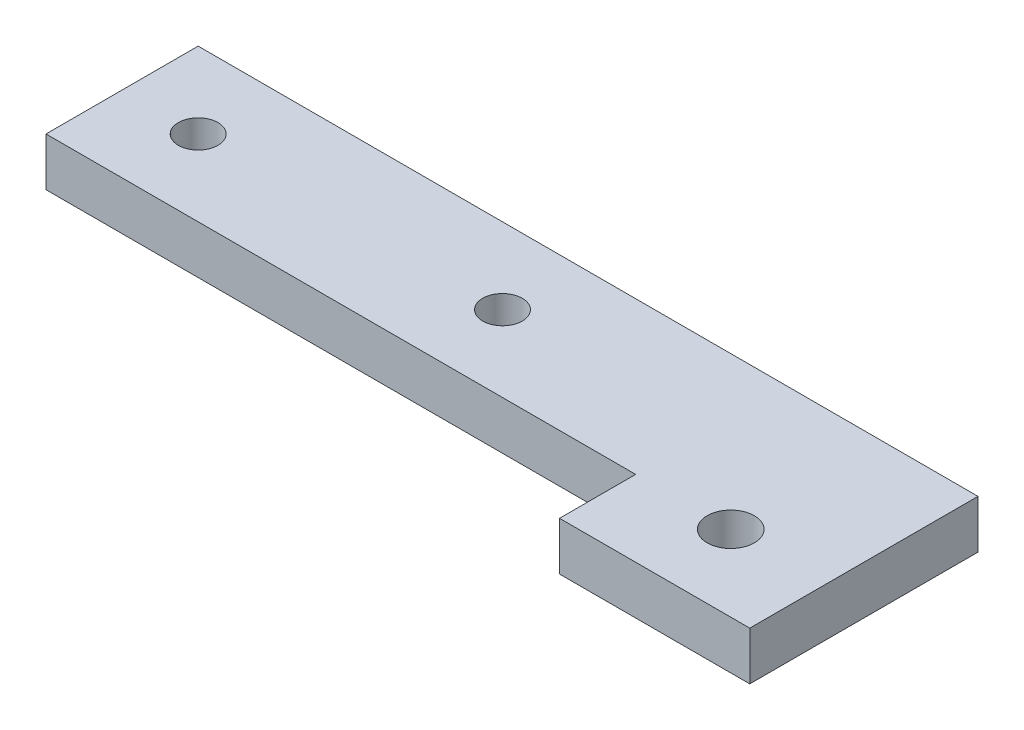
ISO-10303-21;
HEADER;
FILE_DESCRIPTION(('STEP AP214'),'2;1');
FILE_NAME('part.step','',(''),(''),'','','');
FILE_SCHEMA(('AUTOMOTIVE_DESIGN { 1 0 10303 214 1 1 1 1 }'));
ENDSEC;
DATA;
#1=APPLICATION_CONTEXT('core data for automotive mechanical design processes');
#2=APPLICATION_PROTOCOL_DEFINITION('international standard','automotive_design',2000,#1);
#3=PRODUCT_CONTEXT('',#1,'mechanical');
#4=PRODUCT('Part','Part','',(#3));
#5=PRODUCT_RELATED_PRODUCT_CATEGORY('part','',(#4));
#6=PRODUCT_DEFINITION_FORMATION('','',#4);
#7=PRODUCT_DEFINITION_CONTEXT('part definition',#1,'design');
#8=PRODUCT_DEFINITION('design','',#6,#7);
#9=PRODUCT_DEFINITION_SHAPE('','',#8);
#10=(LENGTH_UNIT() NAMED_UNIT(*) SI_UNIT(.MILLI.,.METRE.));
#11=(NAMED_UNIT(*) PLANE_ANGLE_UNIT() SI_UNIT($,.RADIAN.));
#12=(NAMED_UNIT(*) SI_UNIT($,.STERADIAN.) SOLID_ANGLE_UNIT());
#13=UNCERTAINTY_MEASURE_WITH_UNIT(LENGTH_MEASURE(1.E-05),#10,'distance_accuracy_value','');
#14=(GEOMETRIC_REPRESENTATION_CONTEXT(3) GLOBAL_UNCERTAINTY_ASSIGNED_CONTEXT((#13)) GLOBAL_UNIT_ASSIGNED_CONTEXT((#10,
#11,#12)) REPRESENTATION_CONTEXT('',''));
#15=CARTESIAN_POINT('',(0.,0.,0.));
#16=DIRECTION('',(0.,0.,1.));
#17=DIRECTION('',(1.,0.,0.));
#18=AXIS2_PLACEMENT_3D('',#15,#16,#17);
#19=CARTESIAN_POINT('',(-12.5,-3.175,10.));
#20=DIRECTION('',(0.,0.,1.));
#21=DIRECTION('',(1.,0.,0.));
#22=AXIS2_PLACEMENT_3D('',#19,#20,#21);
#23=PLANE('',#22);
#24=DIRECTION('',(0.,1.,0.));
#25=VECTOR('',#24,1.);
#26=CARTESIAN_POINT('',(12.5,-3.175,10.));
#27=LINE('',#26,#25);
#28=CARTESIAN_POINT('',(12.5,-3.175,10.));
#29=VERTEX_POINT('',#28);
#30=CARTESIAN_POINT('',(12.5,3.175,10.));
#31=VERTEX_POINT('',#30);
#32=EDGE_CURVE('E11',#29,#31,#27,.T.);
#33=ORIENTED_EDGE('',*,*,#32,.T.);
#34=DIRECTION('',(1.,0.,0.));
#35=VECTOR('',#34,1.);
#36=CARTESIAN_POINT('',(-12.5,3.175,10.));
#37=LINE('',#36,#35);
#38=CARTESIAN_POINT('',(-12.5,3.175,10.));
#39=VERTEX_POINT('',#38);
#40=EDGE_CURVE('E103',#39,#31,#37,.T.);
#41=ORIENTED_EDGE('',*,*,#40,.F.);
#42=DIRECTION('',(0.,1.,0.));
#43=VECTOR('',#42,1.);
#44=CARTESIAN_POINT('',(-12.5,-3.175,10.));
#45=LINE('',#44,#43);
#46=CARTESIAN_POINT('',(-12.5,-3.175,10.));
#47=VERTEX_POINT('',#46);
#48=EDGE_CURVE('E43',#47,#39,#45,.T.);
#49=ORIENTED_EDGE('',*,*,#48,.F.);
#50=DIRECTION('',(1.,0.,0.));
#51=VECTOR('',#50,1.);
#52=CARTESIAN_POINT('',(-12.5,-3.175,10.));
#53=LINE('',#52,#51);
#54=EDGE_CURVE('E93',#47,#29,#53,.T.);
#55=ORIENTED_EDGE('',*,*,#54,.T.);
#56=EDGE_LOOP('',(#33,#41,#49,#55));
#57=FACE_BOUND('',#56,.T.);
#58=ADVANCED_FACE('F34',(#57),#23,.T.);
#59=CARTESIAN_POINT('',(-12.5,-3.175,0.));
#60=DIRECTION('',(-1.,0.,0.));
#61=DIRECTION('',(0.,0.,1.));
#62=AXIS2_PLACEMENT_3D('',#59,#60,#61);
#63=PLANE('',#62);
#64=ORIENTED_EDGE('',*,*,#48,.T.);
#65=DIRECTION('',(0.,0.,1.));
#66=VECTOR('',#65,1.);
#67=CARTESIAN_POINT('',(-12.5,3.175,0.));
#68=LINE('',#67,#66);
#69=CARTESIAN_POINT('',(-12.5,3.175,0.));
#70=VERTEX_POINT('',#69);
#71=EDGE_CURVE('E115',#70,#39,#68,.T.);
#72=ORIENTED_EDGE('',*,*,#71,.F.);
#73=DIRECTION('',(0.,1.,0.));
#74=VECTOR('',#73,1.);
#75=CARTESIAN_POINT('',(-12.5,-3.175,0.));
#76=LINE('',#75,#74);
#77=CARTESIAN_POINT('',(-12.5,-3.175,0.));
#78=VERTEX_POINT('',#77);
#79=EDGE_CURVE('E140',#78,#70,#76,.T.);
#80=ORIENTED_EDGE('',*,*,#79,.F.);
#81=DIRECTION('',(0.,0.,1.));
#82=VECTOR('',#81,1.);
#83=CARTESIAN_POINT('',(-12.5,-3.175,0.));
#84=LINE('',#83,#82);
#85=EDGE_CURVE('E136',#78,#47,#84,.T.);
#86=ORIENTED_EDGE('',*,*,#85,.T.);
#87=EDGE_LOOP('',(#64,#72,#80,#86));
#88=FACE_BOUND('',#87,.T.);
#89=ADVANCED_FACE('F153',(#88),#63,.T.);
#90=CARTESIAN_POINT('',(-12.5,-3.175,0.));
#91=DIRECTION('',(0.,0.,1.));
#92=DIRECTION('',(1.,0.,0.));
#93=AXIS2_PLACEMENT_3D('',#90,#91,#92);
#94=PLANE('',#93);
#95=ORIENTED_EDGE('',*,*,#79,.T.);
#96=DIRECTION('',(1.,0.,0.));
#97=VECTOR('',#96,1.);
#98=CARTESIAN_POINT('',(-12.5,3.175,0.));
#99=LINE('',#98,#97);
#100=CARTESIAN_POINT('',(-90.,3.175,0.));
#101=VERTEX_POINT('',#100);
#102=EDGE_CURVE('E109',#101,#70,#99,.T.);
#103=ORIENTED_EDGE('',*,*,#102,.F.);
#104=DIRECTION('',(0.,1.,0.));
#105=VECTOR('',#104,1.);
#106=CARTESIAN_POINT('',(-90.,-3.175,0.));
#107=LINE('',#106,#105);
#108=CARTESIAN_POINT('',(-90.,-3.175,0.));
#109=VERTEX_POINT('',#108);
#110=EDGE_CURVE('E142',#109,#101,#107,.T.);
#111=ORIENTED_EDGE('',*,*,#110,.F.);
#112=DIRECTION('',(1.,0.,0.));
#113=VECTOR('',#112,1.);
#114=CARTESIAN_POINT('',(-12.5,-3.175,0.));
#115=LINE('',#114,#113);
#116=EDGE_CURVE('E133',#109,#78,#115,.T.);
#117=ORIENTED_EDGE('',*,*,#116,.T.);
#118=EDGE_LOOP('',(#95,#103,#111,#117));
#119=FACE_BOUND('',#118,.T.);
#120=ADVANCED_FACE('F150',(#119),#94,.T.);
#121=CARTESIAN_POINT('',(-90.,-3.175,-20.));
#122=DIRECTION('',(-1.,0.,0.));
#123=DIRECTION('',(0.,0.,1.));
#124=AXIS2_PLACEMENT_3D('',#121,#122,#123);
#125=PLANE('',#124);
#126=ORIENTED_EDGE('',*,*,#110,.T.);
#127=DIRECTION('',(0.,0.,1.));
#128=VECTOR('',#127,1.);
#129=CARTESIAN_POINT('',(-90.,3.175,-20.));
#130=LINE('',#129,#128);
#131=CARTESIAN_POINT('',(-90.,3.175,-20.));
#132=VERTEX_POINT('',#131);
#133=EDGE_CURVE('E107',#132,#101,#130,.T.);
#134=ORIENTED_EDGE('',*,*,#133,.F.);
#135=DIRECTION('',(0.,1.,0.));
#136=VECTOR('',#135,1.);
#137=CARTESIAN_POINT('',(-90.,-3.175,-20.));
#138=LINE('',#137,#136);
#139=CARTESIAN_POINT('',(-90.,-3.175,-20.));
#140=VERTEX_POINT('',#139);
#141=EDGE_CURVE('E92',#140,#132,#138,.T.);
#142=ORIENTED_EDGE('',*,*,#141,.F.);
#143=DIRECTION('',(0.,0.,1.));
#144=VECTOR('',#143,1.);
#145=CARTESIAN_POINT('',(-90.,-3.175,-20.));
#146=LINE('',#145,#144);
#147=EDGE_CURVE('E130',#140,#109,#146,.T.);
#148=ORIENTED_EDGE('',*,*,#147,.T.);
#149=EDGE_LOOP('',(#126,#134,#142,#148));
#150=FACE_BOUND('',#149,.T.);
#151=ADVANCED_FACE('F144',(#150),#125,.T.);
#152=CARTESIAN_POINT('',(12.5,-3.175,-20.));
#153=DIRECTION('',(0.,0.,-1.));
#154=DIRECTION('',(-1.,0.,0.));
#155=AXIS2_PLACEMENT_3D('',#152,#153,#154);
#156=PLANE('',#155);
#157=ORIENTED_EDGE('',*,*,#141,.T.);
#158=DIRECTION('',(-1.,0.,0.));
#159=VECTOR('',#158,1.);
#160=CARTESIAN_POINT('',(12.5,3.175,-20.));
#161=LINE('',#160,#159);
#162=CARTESIAN_POINT('',(12.5,3.175,-20.));
#163=VERTEX_POINT('',#162);
#164=EDGE_CURVE('E100',#163,#132,#161,.T.);
#165=ORIENTED_EDGE('',*,*,#164,.F.);
#166=DIRECTION('',(0.,1.,0.));
#167=VECTOR('',#166,1.);
#168=CARTESIAN_POINT('',(12.5,-3.175,-20.));
#169=LINE('',#168,#167);
#170=CARTESIAN_POINT('',(12.5,-3.175,-20.));
#171=VERTEX_POINT('',#170);
#172=EDGE_CURVE('E38',#171,#163,#169,.T.);
#173=ORIENTED_EDGE('',*,*,#172,.F.);
#174=DIRECTION('',(-1.,0.,0.));
#175=VECTOR('',#174,1.);
#176=CARTESIAN_POINT('',(12.5,-3.175,-20.));
#177=LINE('',#176,#175);
#178=EDGE_CURVE('E128',#171,#140,#177,.T.);
#179=ORIENTED_EDGE('',*,*,#178,.T.);
#180=EDGE_LOOP('',(#157,#165,#173,#179));
#181=FACE_BOUND('',#180,.T.);
#182=ADVANCED_FACE('F106',(#181),#156,.T.);
#183=CARTESIAN_POINT('',(12.5,-3.175,0.));
#184=DIRECTION('',(1.,0.,0.));
#185=DIRECTION('',(0.,0.,-1.));
#186=AXIS2_PLACEMENT_3D('',#183,#184,#185);
#187=PLANE('',#186);
#188=ORIENTED_EDGE('',*,*,#172,.T.);
#189=DIRECTION('',(0.,0.,-1.));
#190=VECTOR('',#189,1.);
#191=CARTESIAN_POINT('',(12.5,3.175,0.));
#192=LINE('',#191,#190);
#193=EDGE_CURVE('E86',#31,#163,#192,.T.);
#194=ORIENTED_EDGE('',*,*,#193,.F.);
#195=ORIENTED_EDGE('',*,*,#32,.F.);
#196=DIRECTION('',(0.,0.,-1.));
#197=VECTOR('',#196,1.);
#198=CARTESIAN_POINT('',(12.5,-3.175,0.));
#199=LINE('',#198,#197);
#200=EDGE_CURVE('E87',#29,#171,#199,.T.);
#201=ORIENTED_EDGE('',*,*,#200,.T.);
#202=EDGE_LOOP('',(#188,#194,#195,#201));
#203=FACE_BOUND('',#202,.T.);
#204=ADVANCED_FACE('F36',(#203),#187,.T.);
#205=CARTESIAN_POINT('',(0.,-3.175,0.));
#206=DIRECTION('',(0.,1.,0.));
#207=DIRECTION('',(0.,0.,1.));
#208=AXIS2_PLACEMENT_3D('',#205,#206,#207);
#209=PLANE('',#208);
#210=CARTESIAN_POINT('',(-80.,-3.175,-9.99999999999999));
#211=DIRECTION('',(0.,1.,0.));
#212=DIRECTION('',(0.,0.,1.));
#213=AXIS2_PLACEMENT_3D('',#210,#211,#212);
#214=CIRCLE('',#213,2.59999999999999);
#215=CARTESIAN_POINT('',(-80.,-3.175,-7.4));
#216=VERTEX_POINT('',#215);
#217=EDGE_CURVE('E118',#216,#216,#214,.T.);
#218=ORIENTED_EDGE('',*,*,#217,.T.);
#219=EDGE_LOOP('',(#218));
#220=FACE_BOUND('',#219,.T.);
#221=CARTESIAN_POINT('',(-40.,-3.175,-10.));
#222=DIRECTION('',(0.,1.,0.));
#223=DIRECTION('',(0.,0.,1.));
#224=AXIS2_PLACEMENT_3D('',#221,#222,#223);
#225=CIRCLE('',#224,2.6);
#226=CARTESIAN_POINT('',(-40.,-3.175,-7.39999999999999));
#227=VERTEX_POINT('',#226);
#228=EDGE_CURVE('E121',#227,#227,#225,.T.);
#229=ORIENTED_EDGE('',*,*,#228,.T.);
#230=EDGE_LOOP('',(#229));
#231=FACE_BOUND('',#230,.T.);
#232=CARTESIAN_POINT('',(0.,-3.175,0.));
#233=DIRECTION('',(0.,1.,0.));
#234=DIRECTION('',(0.,0.,1.));
#235=AXIS2_PLACEMENT_3D('',#232,#233,#234);
#236=CIRCLE('',#235,3.1);
#237=CARTESIAN_POINT('',(0.,-3.175,3.1));
#238=VERTEX_POINT('',#237);
#239=EDGE_CURVE('E124',#238,#238,#236,.T.);
#240=ORIENTED_EDGE('',*,*,#239,.T.);
#241=EDGE_LOOP('',(#240));
#242=FACE_BOUND('',#241,.T.);
#243=ORIENTED_EDGE('',*,*,#200,.F.);
#244=ORIENTED_EDGE('',*,*,#54,.F.);
#245=ORIENTED_EDGE('',*,*,#85,.F.);
#246=ORIENTED_EDGE('',*,*,#116,.F.);
#247=ORIENTED_EDGE('',*,*,#147,.F.);
#248=ORIENTED_EDGE('',*,*,#178,.F.);
#249=EDGE_LOOP('',(#243,#244,#245,#246,#247,#248));
#250=FACE_BOUND('',#249,.T.);
#251=ADVANCED_FACE('F156',(#220,#231,#242,#250),#209,.F.);
#252=CARTESIAN_POINT('',(0.,-3.175,0.));
#253=DIRECTION('',(0.,1.,0.));
#254=DIRECTION('',(0.,0.,1.));
#255=AXIS2_PLACEMENT_3D('',#252,#253,#254);
#256=CYLINDRICAL_SURFACE('',#255,3.1);
#257=ORIENTED_EDGE('',*,*,#239,.F.);
#258=EDGE_LOOP('',(#257));
#259=FACE_BOUND('',#258,.T.);
#260=CARTESIAN_POINT('',(0.,3.175,0.));
#261=DIRECTION('',(0.,1.,0.));
#262=DIRECTION('',(0.,0.,1.));
#263=AXIS2_PLACEMENT_3D('',#260,#261,#262);
#264=CIRCLE('',#263,3.1);
#265=CARTESIAN_POINT('',(0.,3.175,3.1));
#266=VERTEX_POINT('',#265);
#267=EDGE_CURVE('E104',#266,#266,#264,.T.);
#268=ORIENTED_EDGE('',*,*,#267,.T.);
#269=EDGE_LOOP('',(#268));
#270=FACE_BOUND('',#269,.T.);
#271=ADVANCED_FACE('F176',(#259,#270),#256,.F.);
#272=CARTESIAN_POINT('',(-40.,-3.175,-10.));
#273=DIRECTION('',(0.,1.,0.));
#274=DIRECTION('',(0.,0.,1.));
#275=AXIS2_PLACEMENT_3D('',#272,#273,#274);
#276=CYLINDRICAL_SURFACE('',#275,2.6);
#277=ORIENTED_EDGE('',*,*,#228,.F.);
#278=EDGE_LOOP('',(#277));
#279=FACE_BOUND('',#278,.T.);
#280=CARTESIAN_POINT('',(-40.,3.175,-10.));
#281=DIRECTION('',(0.,1.,0.));
#282=DIRECTION('',(0.,0.,1.));
#283=AXIS2_PLACEMENT_3D('',#280,#281,#282);
#284=CIRCLE('',#283,2.6);
#285=CARTESIAN_POINT('',(-40.,3.175,-7.39999999999999));
#286=VERTEX_POINT('',#285);
#287=EDGE_CURVE('E191',#286,#286,#284,.T.);
#288=ORIENTED_EDGE('',*,*,#287,.T.);
#289=EDGE_LOOP('',(#288));
#290=FACE_BOUND('',#289,.T.);
#291=ADVANCED_FACE('F181',(#279,#290),#276,.F.);
#292=CARTESIAN_POINT('',(-80.,-3.175,-9.99999999999999));
#293=DIRECTION('',(0.,1.,0.));
#294=DIRECTION('',(0.,0.,1.));
#295=AXIS2_PLACEMENT_3D('',#292,#293,#294);
#296=CYLINDRICAL_SURFACE('',#295,2.59999999999999);
#297=ORIENTED_EDGE('',*,*,#217,.F.);
#298=EDGE_LOOP('',(#297));
#299=FACE_BOUND('',#298,.T.);
#300=CARTESIAN_POINT('',(-80.,3.175,-9.99999999999999));
#301=DIRECTION('',(0.,1.,0.));
#302=DIRECTION('',(0.,0.,1.));
#303=AXIS2_PLACEMENT_3D('',#300,#301,#302);
#304=CIRCLE('',#303,2.59999999999999);
#305=CARTESIAN_POINT('',(-80.,3.175,-7.4));
#306=VERTEX_POINT('',#305);
#307=EDGE_CURVE('E193',#306,#306,#304,.T.);
#308=ORIENTED_EDGE('',*,*,#307,.T.);
#309=EDGE_LOOP('',(#308));
#310=FACE_BOUND('',#309,.T.);
#311=ADVANCED_FACE('F199',(#299,#310),#296,.F.);
#312=CARTESIAN_POINT('',(0.,3.175,0.));
#313=DIRECTION('',(0.,1.,0.));
#314=DIRECTION('',(0.,0.,1.));
#315=AXIS2_PLACEMENT_3D('',#312,#313,#314);
#316=PLANE('',#315);
#317=ORIENTED_EDGE('',*,*,#287,.F.);
#318=EDGE_LOOP('',(#317));
#319=FACE_BOUND('',#318,.T.);
#320=ORIENTED_EDGE('',*,*,#193,.T.);
#321=ORIENTED_EDGE('',*,*,#164,.T.);
#322=ORIENTED_EDGE('',*,*,#133,.T.);
#323=ORIENTED_EDGE('',*,*,#102,.T.);
#324=ORIENTED_EDGE('',*,*,#71,.T.);
#325=ORIENTED_EDGE('',*,*,#40,.T.);
#326=EDGE_LOOP('',(#320,#321,#322,#323,#324,#325));
#327=FACE_BOUND('',#326,.T.);
#328=ORIENTED_EDGE('',*,*,#267,.F.);
#329=EDGE_LOOP('',(#328));
#330=FACE_BOUND('',#329,.T.);
#331=ORIENTED_EDGE('',*,*,#307,.F.);
#332=EDGE_LOOP('',(#331));
#333=FACE_BOUND('',#332,.T.);
#334=ADVANCED_FACE('F97',(#319,#327,#330,#333),#316,.T.);
#335=CLOSED_SHELL('',(#58,#89,#120,#151,#182,#204,#251,#271,#291,#311,#334));
#336=MANIFOLD_SOLID_BREP('B2',#335);
#337=ADVANCED_BREP_SHAPE_REPRESENTATION('',(#18,#336),#14);
#338=SHAPE_DEFINITION_REPRESENTATION(#9,#337);
ENDSEC;
END-ISO-10303-21;
